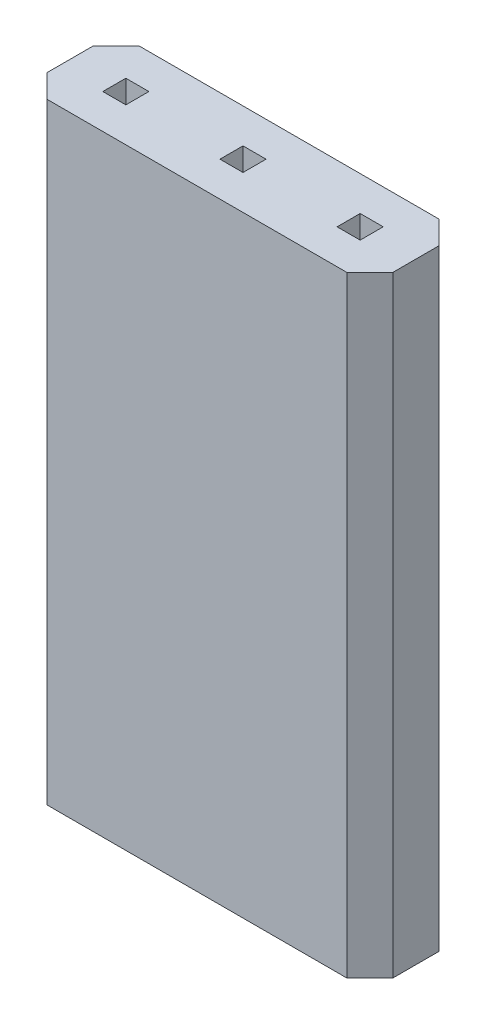
ISO-10303-21;
HEADER;
FILE_DESCRIPTION(('STEP AP214'),'2;1');
FILE_NAME('part.step','',(''),(''),'','','');
FILE_SCHEMA(('AUTOMOTIVE_DESIGN { 1 0 10303 214 1 1 1 1 }'));
ENDSEC;
DATA;
#1=APPLICATION_CONTEXT('core data for automotive mechanical design processes');
#2=APPLICATION_PROTOCOL_DEFINITION('international standard','automotive_design',2000,#1);
#3=PRODUCT_CONTEXT('',#1,'mechanical');
#4=PRODUCT('Part','Part','',(#3));
#5=PRODUCT_RELATED_PRODUCT_CATEGORY('part','',(#4));
#6=PRODUCT_DEFINITION_FORMATION('','',#4);
#7=PRODUCT_DEFINITION_CONTEXT('part definition',#1,'design');
#8=PRODUCT_DEFINITION('design','',#6,#7);
#9=PRODUCT_DEFINITION_SHAPE('','',#8);
#10=(LENGTH_UNIT() NAMED_UNIT(*) SI_UNIT(.MILLI.,.METRE.));
#11=(NAMED_UNIT(*) PLANE_ANGLE_UNIT() SI_UNIT($,.RADIAN.));
#12=(NAMED_UNIT(*) SI_UNIT($,.STERADIAN.) SOLID_ANGLE_UNIT());
#13=UNCERTAINTY_MEASURE_WITH_UNIT(LENGTH_MEASURE(1.E-05),#10,'distance_accuracy_value','');
#14=(GEOMETRIC_REPRESENTATION_CONTEXT(3) GLOBAL_UNCERTAINTY_ASSIGNED_CONTEXT((#13)) GLOBAL_UNIT_ASSIGNED_CONTEXT((#10,
#11,#12)) REPRESENTATION_CONTEXT('',''));
#15=CARTESIAN_POINT('',(0.,0.,0.));
#16=DIRECTION('',(0.,0.,1.));
#17=DIRECTION('',(1.,0.,0.));
#18=AXIS2_PLACEMENT_3D('',#15,#16,#17);
#19=CARTESIAN_POINT('',(0.,13.25,0.));
#20=DIRECTION('',(0.,1.,0.));
#21=DIRECTION('',(0.,0.,1.));
#22=AXIS2_PLACEMENT_3D('',#19,#20,#21);
#23=PLANE('',#22);
#24=DIRECTION('',(-1.,0.,0.));
#25=VECTOR('',#24,1.);
#26=CARTESIAN_POINT('',(0.,13.25,0.25));
#27=LINE('',#26,#25);
#28=CARTESIAN_POINT('',(0.25,13.25,0.25));
#29=VERTEX_POINT('',#28);
#30=CARTESIAN_POINT('',(-0.25,13.25,0.25));
#31=VERTEX_POINT('',#30);
#32=EDGE_CURVE('E322',#29,#31,#27,.T.);
#33=ORIENTED_EDGE('',*,*,#32,.T.);
#34=DIRECTION('',(0.,0.,-1.));
#35=VECTOR('',#34,1.);
#36=CARTESIAN_POINT('',(-0.25,13.25,0.));
#37=LINE('',#36,#35);
#38=CARTESIAN_POINT('',(-0.25,13.25,-0.25));
#39=VERTEX_POINT('',#38);
#40=EDGE_CURVE('E288',#31,#39,#37,.T.);
#41=ORIENTED_EDGE('',*,*,#40,.T.);
#42=DIRECTION('',(1.,0.,0.));
#43=VECTOR('',#42,1.);
#44=CARTESIAN_POINT('',(0.,13.25,-0.25));
#45=LINE('',#44,#43);
#46=CARTESIAN_POINT('',(0.25,13.25,-0.25));
#47=VERTEX_POINT('',#46);
#48=EDGE_CURVE('E331',#39,#47,#45,.T.);
#49=ORIENTED_EDGE('',*,*,#48,.T.);
#50=DIRECTION('',(0.,0.,1.));
#51=VECTOR('',#50,1.);
#52=CARTESIAN_POINT('',(0.25,13.25,0.));
#53=LINE('',#52,#51);
#54=EDGE_CURVE('E334',#47,#29,#53,.T.);
#55=ORIENTED_EDGE('',*,*,#54,.T.);
#56=EDGE_LOOP('',(#33,#41,#49,#55));
#57=FACE_BOUND('',#56,.T.);
#58=DIRECTION('',(0.,0.,-1.));
#59=VECTOR('',#58,1.);
#60=CARTESIAN_POINT('',(2.29,13.25,0.));
#61=LINE('',#60,#59);
#62=CARTESIAN_POINT('',(2.29,13.25,0.25));
#63=VERTEX_POINT('',#62);
#64=CARTESIAN_POINT('',(2.29,13.25,-0.25));
#65=VERTEX_POINT('',#64);
#66=EDGE_CURVE('E260',#63,#65,#61,.T.);
#67=ORIENTED_EDGE('',*,*,#66,.T.);
#68=DIRECTION('',(1.,0.,0.));
#69=VECTOR('',#68,1.);
#70=CARTESIAN_POINT('',(0.,13.25,-0.25));
#71=LINE('',#70,#69);
#72=CARTESIAN_POINT('',(2.79,13.25,-0.25));
#73=VERTEX_POINT('',#72);
#74=EDGE_CURVE('E267',#65,#73,#71,.T.);
#75=ORIENTED_EDGE('',*,*,#74,.T.);
#76=DIRECTION('',(0.,0.,1.));
#77=VECTOR('',#76,1.);
#78=CARTESIAN_POINT('',(2.79,13.25,0.));
#79=LINE('',#78,#77);
#80=CARTESIAN_POINT('',(2.79,13.25,0.25));
#81=VERTEX_POINT('',#80);
#82=EDGE_CURVE('E270',#73,#81,#79,.T.);
#83=ORIENTED_EDGE('',*,*,#82,.T.);
#84=DIRECTION('',(-1.,0.,0.));
#85=VECTOR('',#84,1.);
#86=CARTESIAN_POINT('',(0.,13.25,0.25));
#87=LINE('',#86,#85);
#88=EDGE_CURVE('E274',#81,#63,#87,.T.);
#89=ORIENTED_EDGE('',*,*,#88,.T.);
#90=EDGE_LOOP('',(#67,#75,#83,#89));
#91=FACE_BOUND('',#90,.T.);
#92=DIRECTION('',(0.,0.,-1.));
#93=VECTOR('',#92,1.);
#94=CARTESIAN_POINT('',(-2.79,13.25,0.));
#95=LINE('',#94,#93);
#96=CARTESIAN_POINT('',(-2.79,13.25,0.250000000000018));
#97=VERTEX_POINT('',#96);
#98=CARTESIAN_POINT('',(-2.79,13.25,-0.249999999999982));
#99=VERTEX_POINT('',#98);
#100=EDGE_CURVE('E293',#97,#99,#95,.T.);
#101=ORIENTED_EDGE('',*,*,#100,.T.);
#102=DIRECTION('',(1.,0.,0.));
#103=VECTOR('',#102,1.);
#104=CARTESIAN_POINT('',(0.,13.25,-0.249999999999982));
#105=LINE('',#104,#103);
#106=CARTESIAN_POINT('',(-2.29,13.25,-0.249999999999982));
#107=VERTEX_POINT('',#106);
#108=EDGE_CURVE('E255',#99,#107,#105,.T.);
#109=ORIENTED_EDGE('',*,*,#108,.T.);
#110=DIRECTION('',(0.,0.,1.));
#111=VECTOR('',#110,1.);
#112=CARTESIAN_POINT('',(-2.29,13.25,0.));
#113=LINE('',#112,#111);
#114=CARTESIAN_POINT('',(-2.29,13.25,0.250000000000018));
#115=VERTEX_POINT('',#114);
#116=EDGE_CURVE('E302',#107,#115,#113,.T.);
#117=ORIENTED_EDGE('',*,*,#116,.T.);
#118=DIRECTION('',(-1.,0.,0.));
#119=VECTOR('',#118,1.);
#120=CARTESIAN_POINT('',(0.,13.25,0.250000000000018));
#121=LINE('',#120,#119);
#122=EDGE_CURVE('E305',#115,#97,#121,.T.);
#123=ORIENTED_EDGE('',*,*,#122,.T.);
#124=EDGE_LOOP('',(#101,#109,#117,#123));
#125=FACE_BOUND('',#124,.T.);
#126=DIRECTION('',(-1.,0.,0.));
#127=VECTOR('',#126,1.);
#128=CARTESIAN_POINT('',(-3.75,13.25,-1.));
#129=LINE('',#128,#127);
#130=CARTESIAN_POINT('',(3.25,13.25,-0.999999999999999));
#131=VERTEX_POINT('',#130);
#132=CARTESIAN_POINT('',(-3.25,13.25,-1.));
#133=VERTEX_POINT('',#132);
#134=EDGE_CURVE('E203',#131,#133,#129,.T.);
#135=ORIENTED_EDGE('',*,*,#134,.T.);
#136=DIRECTION('',(0.707106781186548,0.,-0.707106781186548));
#137=VECTOR('',#136,1.);
#138=CARTESIAN_POINT('',(-2.125,13.25,-2.125));
#139=LINE('',#138,#137);
#140=CARTESIAN_POINT('',(-3.75,13.25,-0.5));
#141=VERTEX_POINT('',#140);
#142=EDGE_CURVE('E599',#141,#133,#139,.T.);
#143=ORIENTED_EDGE('',*,*,#142,.F.);
#144=DIRECTION('',(0.,0.,1.));
#145=VECTOR('',#144,1.);
#146=CARTESIAN_POINT('',(-3.75,13.25,-1.));
#147=LINE('',#146,#145);
#148=CARTESIAN_POINT('',(-3.75,13.25,0.5));
#149=VERTEX_POINT('',#148);
#150=EDGE_CURVE('E56',#141,#149,#147,.T.);
#151=ORIENTED_EDGE('',*,*,#150,.T.);
#152=DIRECTION('',(-0.707106781186547,0.,-0.707106781186548));
#153=VECTOR('',#152,1.);
#154=CARTESIAN_POINT('',(-2.125,13.25,2.125));
#155=LINE('',#154,#153);
#156=CARTESIAN_POINT('',(-3.25,13.25,1.));
#157=VERTEX_POINT('',#156);
#158=EDGE_CURVE('E250',#157,#149,#155,.T.);
#159=ORIENTED_EDGE('',*,*,#158,.F.);
#160=DIRECTION('',(1.,0.,0.));
#161=VECTOR('',#160,1.);
#162=CARTESIAN_POINT('',(-3.75,13.25,1.));
#163=LINE('',#162,#161);
#164=CARTESIAN_POINT('',(3.25,13.25,1.));
#165=VERTEX_POINT('',#164);
#166=EDGE_CURVE('E11',#157,#165,#163,.T.);
#167=ORIENTED_EDGE('',*,*,#166,.T.);
#168=DIRECTION('',(-0.707106781186547,0.,0.707106781186548));
#169=VECTOR('',#168,1.);
#170=CARTESIAN_POINT('',(2.125,13.25,2.125));
#171=LINE('',#170,#169);
#172=CARTESIAN_POINT('',(3.75,13.25,0.5));
#173=VERTEX_POINT('',#172);
#174=EDGE_CURVE('E241',#173,#165,#171,.T.);
#175=ORIENTED_EDGE('',*,*,#174,.F.);
#176=DIRECTION('',(0.,0.,-1.));
#177=VECTOR('',#176,1.);
#178=CARTESIAN_POINT('',(3.75,13.25,-1.));
#179=LINE('',#178,#177);
#180=CARTESIAN_POINT('',(3.75,13.25,-0.5));
#181=VERTEX_POINT('',#180);
#182=EDGE_CURVE('E206',#173,#181,#179,.T.);
#183=ORIENTED_EDGE('',*,*,#182,.T.);
#184=DIRECTION('',(-0.707106781186548,0.,-0.707106781186548));
#185=VECTOR('',#184,1.);
#186=CARTESIAN_POINT('',(2.125,13.25,-2.125));
#187=LINE('',#186,#185);
#188=EDGE_CURVE('E188',#181,#131,#187,.T.);
#189=ORIENTED_EDGE('',*,*,#188,.T.);
#190=EDGE_LOOP('',(#135,#143,#151,#159,#167,#175,#183,#189));
#191=FACE_BOUND('',#190,.T.);
#192=ADVANCED_FACE('F47',(#57,#91,#125,#191),#23,.T.);
#193=CARTESIAN_POINT('',(3.75,13.25,-1.));
#194=DIRECTION('',(-1.,0.,0.));
#195=DIRECTION('',(0.,0.,1.));
#196=AXIS2_PLACEMENT_3D('',#193,#194,#195);
#197=PLANE('',#196);
#198=DIRECTION('',(0.,-1.,0.));
#199=VECTOR('',#198,1.);
#200=CARTESIAN_POINT('',(3.75,13.25,0.5));
#201=LINE('',#200,#199);
#202=CARTESIAN_POINT('',(3.75,0.,0.5));
#203=VERTEX_POINT('',#202);
#204=EDGE_CURVE('E243',#173,#203,#201,.T.);
#205=ORIENTED_EDGE('',*,*,#204,.T.);
#206=DIRECTION('',(0.,0.,-1.));
#207=VECTOR('',#206,1.);
#208=CARTESIAN_POINT('',(3.75,0.,-1.));
#209=LINE('',#208,#207);
#210=CARTESIAN_POINT('',(3.75,0.,-0.5));
#211=VERTEX_POINT('',#210);
#212=EDGE_CURVE('E215',#203,#211,#209,.T.);
#213=ORIENTED_EDGE('',*,*,#212,.T.);
#214=DIRECTION('',(0.,-1.,0.));
#215=VECTOR('',#214,1.);
#216=CARTESIAN_POINT('',(3.75,13.25,-0.5));
#217=LINE('',#216,#215);
#218=EDGE_CURVE('E197',#181,#211,#217,.T.);
#219=ORIENTED_EDGE('',*,*,#218,.F.);
#220=ORIENTED_EDGE('',*,*,#182,.F.);
#221=EDGE_LOOP('',(#205,#213,#219,#220));
#222=FACE_BOUND('',#221,.T.);
#223=ADVANCED_FACE('F49',(#222),#197,.F.);
#224=CARTESIAN_POINT('',(-3.75,13.25,-1.));
#225=DIRECTION('',(0.,0.,1.));
#226=DIRECTION('',(1.,0.,0.));
#227=AXIS2_PLACEMENT_3D('',#224,#225,#226);
#228=PLANE('',#227);
#229=DIRECTION('',(0.,-1.,0.));
#230=VECTOR('',#229,1.);
#231=CARTESIAN_POINT('',(-3.25,13.25,-1.));
#232=LINE('',#231,#230);
#233=CARTESIAN_POINT('',(-3.25,0.,-1.));
#234=VERTEX_POINT('',#233);
#235=EDGE_CURVE('E64',#133,#234,#232,.T.);
#236=ORIENTED_EDGE('',*,*,#235,.F.);
#237=ORIENTED_EDGE('',*,*,#134,.F.);
#238=DIRECTION('',(0.,-1.,0.));
#239=VECTOR('',#238,1.);
#240=CARTESIAN_POINT('',(3.25,13.25,-0.999999999999999));
#241=LINE('',#240,#239);
#242=CARTESIAN_POINT('',(3.25,0.,-0.999999999999999));
#243=VERTEX_POINT('',#242);
#244=EDGE_CURVE('E185',#131,#243,#241,.T.);
#245=ORIENTED_EDGE('',*,*,#244,.T.);
#246=DIRECTION('',(-1.,0.,0.));
#247=VECTOR('',#246,1.);
#248=CARTESIAN_POINT('',(-3.75,0.,-1.));
#249=LINE('',#248,#247);
#250=EDGE_CURVE('E218',#243,#234,#249,.T.);
#251=ORIENTED_EDGE('',*,*,#250,.T.);
#252=EDGE_LOOP('',(#236,#237,#245,#251));
#253=FACE_BOUND('',#252,.T.);
#254=ADVANCED_FACE('F208',(#253),#228,.F.);
#255=CARTESIAN_POINT('',(-3.75,13.25,-1.));
#256=DIRECTION('',(1.,0.,0.));
#257=DIRECTION('',(0.,0.,-1.));
#258=AXIS2_PLACEMENT_3D('',#255,#256,#257);
#259=PLANE('',#258);
#260=DIRECTION('',(0.,-1.,0.));
#261=VECTOR('',#260,1.);
#262=CARTESIAN_POINT('',(-3.75,13.25,-0.5));
#263=LINE('',#262,#261);
#264=CARTESIAN_POINT('',(-3.75,0.,-0.5));
#265=VERTEX_POINT('',#264);
#266=EDGE_CURVE('E598',#141,#265,#263,.T.);
#267=ORIENTED_EDGE('',*,*,#266,.T.);
#268=DIRECTION('',(0.,0.,1.));
#269=VECTOR('',#268,1.);
#270=CARTESIAN_POINT('',(-3.75,0.,-1.));
#271=LINE('',#270,#269);
#272=CARTESIAN_POINT('',(-3.75,0.,0.5));
#273=VERTEX_POINT('',#272);
#274=EDGE_CURVE('E220',#265,#273,#271,.T.);
#275=ORIENTED_EDGE('',*,*,#274,.T.);
#276=DIRECTION('',(0.,-1.,0.));
#277=VECTOR('',#276,1.);
#278=CARTESIAN_POINT('',(-3.75,13.25,0.5));
#279=LINE('',#278,#277);
#280=EDGE_CURVE('E72',#149,#273,#279,.T.);
#281=ORIENTED_EDGE('',*,*,#280,.F.);
#282=ORIENTED_EDGE('',*,*,#150,.F.);
#283=EDGE_LOOP('',(#267,#275,#281,#282));
#284=FACE_BOUND('',#283,.T.);
#285=ADVANCED_FACE('F386',(#284),#259,.F.);
#286=CARTESIAN_POINT('',(-3.75,13.25,1.));
#287=DIRECTION('',(0.,0.,-1.));
#288=DIRECTION('',(-1.,0.,0.));
#289=AXIS2_PLACEMENT_3D('',#286,#287,#288);
#290=PLANE('',#289);
#291=DIRECTION('',(0.,-1.,0.));
#292=VECTOR('',#291,1.);
#293=CARTESIAN_POINT('',(3.25,13.25,1.));
#294=LINE('',#293,#292);
#295=CARTESIAN_POINT('',(3.25,0.,1.));
#296=VERTEX_POINT('',#295);
#297=EDGE_CURVE('E232',#165,#296,#294,.T.);
#298=ORIENTED_EDGE('',*,*,#297,.F.);
#299=ORIENTED_EDGE('',*,*,#166,.F.);
#300=DIRECTION('',(0.,-1.,0.));
#301=VECTOR('',#300,1.);
#302=CARTESIAN_POINT('',(-3.25,13.25,1.));
#303=LINE('',#302,#301);
#304=CARTESIAN_POINT('',(-3.25,0.,1.));
#305=VERTEX_POINT('',#304);
#306=EDGE_CURVE('E233',#157,#305,#303,.T.);
#307=ORIENTED_EDGE('',*,*,#306,.T.);
#308=DIRECTION('',(1.,0.,0.));
#309=VECTOR('',#308,1.);
#310=CARTESIAN_POINT('',(-3.75,0.,1.));
#311=LINE('',#310,#309);
#312=EDGE_CURVE('E51',#305,#296,#311,.T.);
#313=ORIENTED_EDGE('',*,*,#312,.T.);
#314=EDGE_LOOP('',(#298,#299,#307,#313));
#315=FACE_BOUND('',#314,.T.);
#316=ADVANCED_FACE('F230',(#315),#290,.F.);
#317=CARTESIAN_POINT('',(0.,0.,0.));
#318=DIRECTION('',(0.,1.,0.));
#319=DIRECTION('',(0.,0.,1.));
#320=AXIS2_PLACEMENT_3D('',#317,#318,#319);
#321=PLANE('',#320);
#322=DIRECTION('',(0.707106781186548,0.,-0.707106781186548));
#323=VECTOR('',#322,1.);
#324=CARTESIAN_POINT('',(-2.125,0.,-2.125));
#325=LINE('',#324,#323);
#326=EDGE_CURVE('E249',#265,#234,#325,.T.);
#327=ORIENTED_EDGE('',*,*,#326,.T.);
#328=ORIENTED_EDGE('',*,*,#250,.F.);
#329=DIRECTION('',(-0.707106781186548,0.,-0.707106781186548));
#330=VECTOR('',#329,1.);
#331=CARTESIAN_POINT('',(2.125,0.,-2.125));
#332=LINE('',#331,#330);
#333=EDGE_CURVE('E191',#211,#243,#332,.T.);
#334=ORIENTED_EDGE('',*,*,#333,.F.);
#335=ORIENTED_EDGE('',*,*,#212,.F.);
#336=DIRECTION('',(-0.707106781186547,0.,0.707106781186548));
#337=VECTOR('',#336,1.);
#338=CARTESIAN_POINT('',(2.125,0.,2.125));
#339=LINE('',#338,#337);
#340=EDGE_CURVE('E196',#203,#296,#339,.T.);
#341=ORIENTED_EDGE('',*,*,#340,.T.);
#342=ORIENTED_EDGE('',*,*,#312,.F.);
#343=DIRECTION('',(-0.707106781186547,0.,-0.707106781186548));
#344=VECTOR('',#343,1.);
#345=CARTESIAN_POINT('',(-2.125,0.,2.125));
#346=LINE('',#345,#344);
#347=EDGE_CURVE('E237',#305,#273,#346,.T.);
#348=ORIENTED_EDGE('',*,*,#347,.T.);
#349=ORIENTED_EDGE('',*,*,#274,.F.);
#350=EDGE_LOOP('',(#327,#328,#334,#335,#341,#342,#348,#349));
#351=FACE_BOUND('',#350,.T.);
#352=ADVANCED_FACE('F236',(#351),#321,.F.);
#353=CARTESIAN_POINT('',(-0.25,6.25,0.));
#354=DIRECTION('',(1.,0.,0.));
#355=DIRECTION('',(0.,0.,-1.));
#356=AXIS2_PLACEMENT_3D('',#353,#354,#355);
#357=PLANE('',#356);
#358=ORIENTED_EDGE('',*,*,#40,.F.);
#359=DIRECTION('',(0.,1.,0.));
#360=VECTOR('',#359,1.);
#361=CARTESIAN_POINT('',(-0.25,6.25,0.25));
#362=LINE('',#361,#360);
#363=CARTESIAN_POINT('',(-0.25,6.25,0.25));
#364=VERTEX_POINT('',#363);
#365=EDGE_CURVE('E328',#364,#31,#362,.T.);
#366=ORIENTED_EDGE('',*,*,#365,.F.);
#367=DIRECTION('',(0.,0.,-1.));
#368=VECTOR('',#367,1.);
#369=CARTESIAN_POINT('',(-0.25,6.25,0.));
#370=LINE('',#369,#368);
#371=CARTESIAN_POINT('',(-0.25,6.25,-0.25));
#372=VERTEX_POINT('',#371);
#373=EDGE_CURVE('E318',#364,#372,#370,.T.);
#374=ORIENTED_EDGE('',*,*,#373,.T.);
#375=DIRECTION('',(0.,1.,0.));
#376=VECTOR('',#375,1.);
#377=CARTESIAN_POINT('',(-0.25,6.25,-0.25));
#378=LINE('',#377,#376);
#379=EDGE_CURVE('E219',#372,#39,#378,.T.);
#380=ORIENTED_EDGE('',*,*,#379,.T.);
#381=EDGE_LOOP('',(#358,#366,#374,#380));
#382=FACE_BOUND('',#381,.T.);
#383=ADVANCED_FACE('F347',(#382),#357,.T.);
#384=CARTESIAN_POINT('',(0.,6.25,-0.25));
#385=DIRECTION('',(0.,0.,1.));
#386=DIRECTION('',(1.,0.,0.));
#387=AXIS2_PLACEMENT_3D('',#384,#385,#386);
#388=PLANE('',#387);
#389=ORIENTED_EDGE('',*,*,#48,.F.);
#390=ORIENTED_EDGE('',*,*,#379,.F.);
#391=DIRECTION('',(1.,0.,0.));
#392=VECTOR('',#391,1.);
#393=CARTESIAN_POINT('',(0.,6.25,-0.25));
#394=LINE('',#393,#392);
#395=CARTESIAN_POINT('',(0.25,6.25,-0.25));
#396=VERTEX_POINT('',#395);
#397=EDGE_CURVE('E321',#372,#396,#394,.T.);
#398=ORIENTED_EDGE('',*,*,#397,.T.);
#399=DIRECTION('',(0.,1.,0.));
#400=VECTOR('',#399,1.);
#401=CARTESIAN_POINT('',(0.25,6.25,-0.25));
#402=LINE('',#401,#400);
#403=EDGE_CURVE('E343',#396,#47,#402,.T.);
#404=ORIENTED_EDGE('',*,*,#403,.T.);
#405=EDGE_LOOP('',(#389,#390,#398,#404));
#406=FACE_BOUND('',#405,.T.);
#407=ADVANCED_FACE('F363',(#406),#388,.T.);
#408=CARTESIAN_POINT('',(0.25,6.25,0.));
#409=DIRECTION('',(-1.,0.,0.));
#410=DIRECTION('',(0.,0.,1.));
#411=AXIS2_PLACEMENT_3D('',#408,#409,#410);
#412=PLANE('',#411);
#413=ORIENTED_EDGE('',*,*,#54,.F.);
#414=ORIENTED_EDGE('',*,*,#403,.F.);
#415=DIRECTION('',(0.,0.,1.));
#416=VECTOR('',#415,1.);
#417=CARTESIAN_POINT('',(0.25,6.25,0.));
#418=LINE('',#417,#416);
#419=CARTESIAN_POINT('',(0.25,6.25,0.25));
#420=VERTEX_POINT('',#419);
#421=EDGE_CURVE('E324',#396,#420,#418,.T.);
#422=ORIENTED_EDGE('',*,*,#421,.T.);
#423=DIRECTION('',(0.,1.,0.));
#424=VECTOR('',#423,1.);
#425=CARTESIAN_POINT('',(0.25,6.25,0.25));
#426=LINE('',#425,#424);
#427=EDGE_CURVE('E341',#420,#29,#426,.T.);
#428=ORIENTED_EDGE('',*,*,#427,.T.);
#429=EDGE_LOOP('',(#413,#414,#422,#428));
#430=FACE_BOUND('',#429,.T.);
#431=ADVANCED_FACE('F365',(#430),#412,.T.);
#432=CARTESIAN_POINT('',(0.,6.25,0.25));
#433=DIRECTION('',(0.,0.,-1.));
#434=DIRECTION('',(-1.,0.,0.));
#435=AXIS2_PLACEMENT_3D('',#432,#433,#434);
#436=PLANE('',#435);
#437=ORIENTED_EDGE('',*,*,#32,.F.);
#438=ORIENTED_EDGE('',*,*,#427,.F.);
#439=DIRECTION('',(-1.,0.,0.));
#440=VECTOR('',#439,1.);
#441=CARTESIAN_POINT('',(0.,6.25,0.25));
#442=LINE('',#441,#440);
#443=EDGE_CURVE('E326',#420,#364,#442,.T.);
#444=ORIENTED_EDGE('',*,*,#443,.T.);
#445=ORIENTED_EDGE('',*,*,#365,.T.);
#446=EDGE_LOOP('',(#437,#438,#444,#445));
#447=FACE_BOUND('',#446,.T.);
#448=ADVANCED_FACE('F357',(#447),#436,.T.);
#449=CARTESIAN_POINT('',(0.,6.25,0.));
#450=DIRECTION('',(0.,-1.,0.));
#451=DIRECTION('',(0.,0.,-1.));
#452=AXIS2_PLACEMENT_3D('',#449,#450,#451);
#453=PLANE('',#452);
#454=ORIENTED_EDGE('',*,*,#373,.F.);
#455=ORIENTED_EDGE('',*,*,#443,.F.);
#456=ORIENTED_EDGE('',*,*,#421,.F.);
#457=ORIENTED_EDGE('',*,*,#397,.F.);
#458=EDGE_LOOP('',(#454,#455,#456,#457));
#459=FACE_BOUND('',#458,.T.);
#460=ADVANCED_FACE('F360',(#459),#453,.F.);
#461=CARTESIAN_POINT('',(0.,6.25,-0.25));
#462=DIRECTION('',(0.,0.,1.));
#463=DIRECTION('',(1.,0.,0.));
#464=AXIS2_PLACEMENT_3D('',#461,#462,#463);
#465=PLANE('',#464);
#466=ORIENTED_EDGE('',*,*,#74,.F.);
#467=DIRECTION('',(0.,1.,0.));
#468=VECTOR('',#467,1.);
#469=CARTESIAN_POINT('',(2.29,6.25,-0.25));
#470=LINE('',#469,#468);
#471=CARTESIAN_POINT('',(2.29,6.25,-0.25));
#472=VERTEX_POINT('',#471);
#473=EDGE_CURVE('E266',#472,#65,#470,.T.);
#474=ORIENTED_EDGE('',*,*,#473,.F.);
#475=DIRECTION('',(1.,0.,0.));
#476=VECTOR('',#475,1.);
#477=CARTESIAN_POINT('',(0.,6.25,-0.25));
#478=LINE('',#477,#476);
#479=CARTESIAN_POINT('',(2.79,6.25,-0.25));
#480=VERTEX_POINT('',#479);
#481=EDGE_CURVE('E256',#472,#480,#478,.T.);
#482=ORIENTED_EDGE('',*,*,#481,.T.);
#483=DIRECTION('',(0.,1.,0.));
#484=VECTOR('',#483,1.);
#485=CARTESIAN_POINT('',(2.79,6.25,-0.25));
#486=LINE('',#485,#484);
#487=EDGE_CURVE('E285',#480,#73,#486,.T.);
#488=ORIENTED_EDGE('',*,*,#487,.T.);
#489=EDGE_LOOP('',(#466,#474,#482,#488));
#490=FACE_BOUND('',#489,.T.);
#491=ADVANCED_FACE('F547',(#490),#465,.T.);
#492=CARTESIAN_POINT('',(2.79,6.25,0.));
#493=DIRECTION('',(-1.,0.,0.));
#494=DIRECTION('',(0.,0.,1.));
#495=AXIS2_PLACEMENT_3D('',#492,#493,#494);
#496=PLANE('',#495);
#497=ORIENTED_EDGE('',*,*,#82,.F.);
#498=ORIENTED_EDGE('',*,*,#487,.F.);
#499=DIRECTION('',(0.,0.,1.));
#500=VECTOR('',#499,1.);
#501=CARTESIAN_POINT('',(2.79,6.25,0.));
#502=LINE('',#501,#500);
#503=CARTESIAN_POINT('',(2.79,6.25,0.25));
#504=VERTEX_POINT('',#503);
#505=EDGE_CURVE('E259',#480,#504,#502,.T.);
#506=ORIENTED_EDGE('',*,*,#505,.T.);
#507=DIRECTION('',(0.,1.,0.));
#508=VECTOR('',#507,1.);
#509=CARTESIAN_POINT('',(2.79,6.25,0.25));
#510=LINE('',#509,#508);
#511=EDGE_CURVE('E283',#504,#81,#510,.T.);
#512=ORIENTED_EDGE('',*,*,#511,.T.);
#513=EDGE_LOOP('',(#497,#498,#506,#512));
#514=FACE_BOUND('',#513,.T.);
#515=ADVANCED_FACE('F539',(#514),#496,.T.);
#516=CARTESIAN_POINT('',(0.,6.25,0.25));
#517=DIRECTION('',(0.,0.,-1.));
#518=DIRECTION('',(-1.,0.,0.));
#519=AXIS2_PLACEMENT_3D('',#516,#517,#518);
#520=PLANE('',#519);
#521=ORIENTED_EDGE('',*,*,#88,.F.);
#522=ORIENTED_EDGE('',*,*,#511,.F.);
#523=DIRECTION('',(-1.,0.,0.));
#524=VECTOR('',#523,1.);
#525=CARTESIAN_POINT('',(0.,6.25,0.25));
#526=LINE('',#525,#524);
#527=CARTESIAN_POINT('',(2.29,6.25,0.25));
#528=VERTEX_POINT('',#527);
#529=EDGE_CURVE('E262',#504,#528,#526,.T.);
#530=ORIENTED_EDGE('',*,*,#529,.T.);
#531=DIRECTION('',(0.,1.,0.));
#532=VECTOR('',#531,1.);
#533=CARTESIAN_POINT('',(2.29,6.25,0.25));
#534=LINE('',#533,#532);
#535=EDGE_CURVE('E281',#528,#63,#534,.T.);
#536=ORIENTED_EDGE('',*,*,#535,.T.);
#537=EDGE_LOOP('',(#521,#522,#530,#536));
#538=FACE_BOUND('',#537,.T.);
#539=ADVANCED_FACE('F531',(#538),#520,.T.);
#540=CARTESIAN_POINT('',(2.29,6.25,0.));
#541=DIRECTION('',(1.,0.,0.));
#542=DIRECTION('',(0.,0.,-1.));
#543=AXIS2_PLACEMENT_3D('',#540,#541,#542);
#544=PLANE('',#543);
#545=ORIENTED_EDGE('',*,*,#66,.F.);
#546=ORIENTED_EDGE('',*,*,#535,.F.);
#547=DIRECTION('',(0.,0.,-1.));
#548=VECTOR('',#547,1.);
#549=CARTESIAN_POINT('',(2.29,6.25,0.));
#550=LINE('',#549,#548);
#551=EDGE_CURVE('E264',#528,#472,#550,.T.);
#552=ORIENTED_EDGE('',*,*,#551,.T.);
#553=ORIENTED_EDGE('',*,*,#473,.T.);
#554=EDGE_LOOP('',(#545,#546,#552,#553));
#555=FACE_BOUND('',#554,.T.);
#556=ADVANCED_FACE('F523',(#555),#544,.T.);
#557=CARTESIAN_POINT('',(0.,6.25,0.));
#558=DIRECTION('',(0.,-1.,0.));
#559=DIRECTION('',(0.,0.,-1.));
#560=AXIS2_PLACEMENT_3D('',#557,#558,#559);
#561=PLANE('',#560);
#562=ORIENTED_EDGE('',*,*,#481,.F.);
#563=ORIENTED_EDGE('',*,*,#551,.F.);
#564=ORIENTED_EDGE('',*,*,#529,.F.);
#565=ORIENTED_EDGE('',*,*,#505,.F.);
#566=EDGE_LOOP('',(#562,#563,#564,#565));
#567=FACE_BOUND('',#566,.T.);
#568=ADVANCED_FACE('F515',(#567),#561,.F.);
#569=CARTESIAN_POINT('',(0.,6.25,-0.249999999999982));
#570=DIRECTION('',(0.,0.,1.));
#571=DIRECTION('',(1.,0.,0.));
#572=AXIS2_PLACEMENT_3D('',#569,#570,#571);
#573=PLANE('',#572);
#574=ORIENTED_EDGE('',*,*,#108,.F.);
#575=DIRECTION('',(0.,1.,0.));
#576=VECTOR('',#575,1.);
#577=CARTESIAN_POINT('',(-2.79,6.25,-0.249999999999982));
#578=LINE('',#577,#576);
#579=CARTESIAN_POINT('',(-2.79,6.25,-0.249999999999982));
#580=VERTEX_POINT('',#579);
#581=EDGE_CURVE('E299',#580,#99,#578,.T.);
#582=ORIENTED_EDGE('',*,*,#581,.F.);
#583=DIRECTION('',(1.,0.,0.));
#584=VECTOR('',#583,1.);
#585=CARTESIAN_POINT('',(0.,6.25,-0.249999999999982));
#586=LINE('',#585,#584);
#587=CARTESIAN_POINT('',(-2.29,6.25,-0.249999999999982));
#588=VERTEX_POINT('',#587);
#589=EDGE_CURVE('E289',#580,#588,#586,.T.);
#590=ORIENTED_EDGE('',*,*,#589,.T.);
#591=DIRECTION('',(0.,1.,0.));
#592=VECTOR('',#591,1.);
#593=CARTESIAN_POINT('',(-2.29,6.25,-0.249999999999982));
#594=LINE('',#593,#592);
#595=EDGE_CURVE('E271',#588,#107,#594,.T.);
#596=ORIENTED_EDGE('',*,*,#595,.T.);
#597=EDGE_LOOP('',(#574,#582,#590,#596));
#598=FACE_BOUND('',#597,.T.);
#599=ADVANCED_FACE('F507',(#598),#573,.T.);
#600=CARTESIAN_POINT('',(-2.29,6.25,0.));
#601=DIRECTION('',(-1.,0.,0.));
#602=DIRECTION('',(0.,0.,1.));
#603=AXIS2_PLACEMENT_3D('',#600,#601,#602);
#604=PLANE('',#603);
#605=ORIENTED_EDGE('',*,*,#116,.F.);
#606=ORIENTED_EDGE('',*,*,#595,.F.);
#607=DIRECTION('',(0.,0.,1.));
#608=VECTOR('',#607,1.);
#609=CARTESIAN_POINT('',(-2.29,6.25,0.));
#610=LINE('',#609,#608);
#611=CARTESIAN_POINT('',(-2.29,6.25,0.250000000000018));
#612=VERTEX_POINT('',#611);
#613=EDGE_CURVE('E292',#588,#612,#610,.T.);
#614=ORIENTED_EDGE('',*,*,#613,.T.);
#615=DIRECTION('',(0.,1.,0.));
#616=VECTOR('',#615,1.);
#617=CARTESIAN_POINT('',(-2.29,6.25,0.250000000000018));
#618=LINE('',#617,#616);
#619=EDGE_CURVE('E314',#612,#115,#618,.T.);
#620=ORIENTED_EDGE('',*,*,#619,.T.);
#621=EDGE_LOOP('',(#605,#606,#614,#620));
#622=FACE_BOUND('',#621,.T.);
#623=ADVANCED_FACE('F499',(#622),#604,.T.);
#624=CARTESIAN_POINT('',(0.,6.25,0.250000000000018));
#625=DIRECTION('',(0.,0.,-1.));
#626=DIRECTION('',(-1.,0.,0.));
#627=AXIS2_PLACEMENT_3D('',#624,#625,#626);
#628=PLANE('',#627);
#629=ORIENTED_EDGE('',*,*,#122,.F.);
#630=ORIENTED_EDGE('',*,*,#619,.F.);
#631=DIRECTION('',(-1.,0.,0.));
#632=VECTOR('',#631,1.);
#633=CARTESIAN_POINT('',(0.,6.25,0.250000000000018));
#634=LINE('',#633,#632);
#635=CARTESIAN_POINT('',(-2.79,6.25,0.250000000000018));
#636=VERTEX_POINT('',#635);
#637=EDGE_CURVE('E295',#612,#636,#634,.T.);
#638=ORIENTED_EDGE('',*,*,#637,.T.);
#639=DIRECTION('',(0.,1.,0.));
#640=VECTOR('',#639,1.);
#641=CARTESIAN_POINT('',(-2.79,6.25,0.250000000000018));
#642=LINE('',#641,#640);
#643=EDGE_CURVE('E312',#636,#97,#642,.T.);
#644=ORIENTED_EDGE('',*,*,#643,.T.);
#645=EDGE_LOOP('',(#629,#630,#638,#644));
#646=FACE_BOUND('',#645,.T.);
#647=ADVANCED_FACE('F491',(#646),#628,.T.);
#648=CARTESIAN_POINT('',(-2.79,6.25,0.));
#649=DIRECTION('',(1.,0.,0.));
#650=DIRECTION('',(0.,0.,-1.));
#651=AXIS2_PLACEMENT_3D('',#648,#649,#650);
#652=PLANE('',#651);
#653=ORIENTED_EDGE('',*,*,#100,.F.);
#654=ORIENTED_EDGE('',*,*,#643,.F.);
#655=DIRECTION('',(0.,0.,-1.));
#656=VECTOR('',#655,1.);
#657=CARTESIAN_POINT('',(-2.79,6.25,0.));
#658=LINE('',#657,#656);
#659=EDGE_CURVE('E297',#636,#580,#658,.T.);
#660=ORIENTED_EDGE('',*,*,#659,.T.);
#661=ORIENTED_EDGE('',*,*,#581,.T.);
#662=EDGE_LOOP('',(#653,#654,#660,#661));
#663=FACE_BOUND('',#662,.T.);
#664=ADVANCED_FACE('F483',(#663),#652,.T.);
#665=CARTESIAN_POINT('',(0.,6.25,0.));
#666=DIRECTION('',(0.,-1.,0.));
#667=DIRECTION('',(0.,0.,-1.));
#668=AXIS2_PLACEMENT_3D('',#665,#666,#667);
#669=PLANE('',#668);
#670=ORIENTED_EDGE('',*,*,#589,.F.);
#671=ORIENTED_EDGE('',*,*,#659,.F.);
#672=ORIENTED_EDGE('',*,*,#637,.F.);
#673=ORIENTED_EDGE('',*,*,#613,.F.);
#674=EDGE_LOOP('',(#670,#671,#672,#673));
#675=FACE_BOUND('',#674,.T.);
#676=ADVANCED_FACE('F412',(#675),#669,.F.);
#677=CARTESIAN_POINT('',(-2.125,13.25,2.125));
#678=DIRECTION('',(-0.707106781186548,0.,0.707106781186547));
#679=DIRECTION('',(0.707106781186547,0.,0.707106781186548));
#680=AXIS2_PLACEMENT_3D('',#677,#678,#679);
#681=PLANE('',#680);
#682=ORIENTED_EDGE('',*,*,#347,.F.);
#683=ORIENTED_EDGE('',*,*,#306,.F.);
#684=ORIENTED_EDGE('',*,*,#158,.T.);
#685=ORIENTED_EDGE('',*,*,#280,.T.);
#686=EDGE_LOOP('',(#682,#683,#684,#685));
#687=FACE_BOUND('',#686,.T.);
#688=ADVANCED_FACE('F409',(#687),#681,.T.);
#689=CARTESIAN_POINT('',(2.125,13.25,-2.125));
#690=DIRECTION('',(-0.707106781186548,0.,0.707106781186548));
#691=DIRECTION('',(0.707106781186548,0.,0.707106781186548));
#692=AXIS2_PLACEMENT_3D('',#689,#690,#691);
#693=PLANE('',#692);
#694=ORIENTED_EDGE('',*,*,#333,.T.);
#695=ORIENTED_EDGE('',*,*,#244,.F.);
#696=ORIENTED_EDGE('',*,*,#188,.F.);
#697=ORIENTED_EDGE('',*,*,#218,.T.);
#698=EDGE_LOOP('',(#694,#695,#696,#697));
#699=FACE_BOUND('',#698,.T.);
#700=ADVANCED_FACE('F187',(#699),#693,.F.);
#701=CARTESIAN_POINT('',(2.125,13.25,2.125));
#702=DIRECTION('',(0.707106781186548,0.,0.707106781186547));
#703=DIRECTION('',(0.707106781186547,0.,-0.707106781186548));
#704=AXIS2_PLACEMENT_3D('',#701,#702,#703);
#705=PLANE('',#704);
#706=ORIENTED_EDGE('',*,*,#340,.F.);
#707=ORIENTED_EDGE('',*,*,#204,.F.);
#708=ORIENTED_EDGE('',*,*,#174,.T.);
#709=ORIENTED_EDGE('',*,*,#297,.T.);
#710=EDGE_LOOP('',(#706,#707,#708,#709));
#711=FACE_BOUND('',#710,.T.);
#712=ADVANCED_FACE('F419',(#711),#705,.T.);
#713=CARTESIAN_POINT('',(-2.125,13.25,-2.125));
#714=DIRECTION('',(-0.707106781186548,0.,-0.707106781186548));
#715=DIRECTION('',(-0.707106781186548,0.,0.707106781186548));
#716=AXIS2_PLACEMENT_3D('',#713,#714,#715);
#717=PLANE('',#716);
#718=ORIENTED_EDGE('',*,*,#326,.F.);
#719=ORIENTED_EDGE('',*,*,#266,.F.);
#720=ORIENTED_EDGE('',*,*,#142,.T.);
#721=ORIENTED_EDGE('',*,*,#235,.T.);
#722=EDGE_LOOP('',(#718,#719,#720,#721));
#723=FACE_BOUND('',#722,.T.);
#724=ADVANCED_FACE('F426',(#723),#717,.T.);
#725=CLOSED_SHELL('',(#192,#223,#254,#285,#316,#352,#383,#407,#431,#448,#460,#491,#515,#539,
#556,#568,#599,#623,#647,#664,#676,#688,#700,#712,#724));
#726=MANIFOLD_SOLID_BREP('B2',#725);
#727=ADVANCED_BREP_SHAPE_REPRESENTATION('',(#18,#726),#14);
#728=SHAPE_DEFINITION_REPRESENTATION(#9,#727);
ENDSEC;
END-ISO-10303-21;
